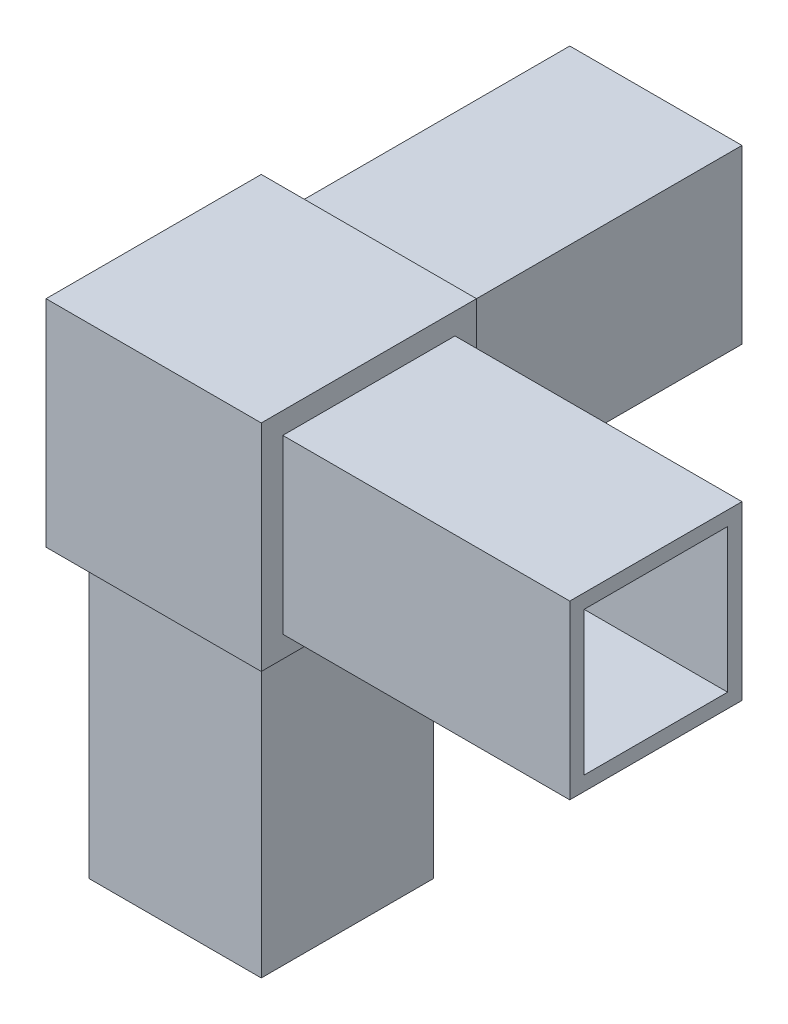
ISO-10303-21;
HEADER;
FILE_DESCRIPTION(('STEP AP214'),'2;1');
FILE_NAME('part.step','',(''),(''),'','','');
FILE_SCHEMA(('AUTOMOTIVE_DESIGN { 1 0 10303 214 1 1 1 1 }'));
ENDSEC;
DATA;
#1=APPLICATION_CONTEXT('core data for automotive mechanical design processes');
#2=APPLICATION_PROTOCOL_DEFINITION('international standard','automotive_design',2000,#1);
#3=PRODUCT_CONTEXT('',#1,'mechanical');
#4=PRODUCT('Part','Part','',(#3));
#5=PRODUCT_RELATED_PRODUCT_CATEGORY('part','',(#4));
#6=PRODUCT_DEFINITION_FORMATION('','',#4);
#7=PRODUCT_DEFINITION_CONTEXT('part definition',#1,'design');
#8=PRODUCT_DEFINITION('design','',#6,#7);
#9=PRODUCT_DEFINITION_SHAPE('','',#8);
#10=(LENGTH_UNIT() NAMED_UNIT(*) SI_UNIT(.MILLI.,.METRE.));
#11=(NAMED_UNIT(*) PLANE_ANGLE_UNIT() SI_UNIT($,.RADIAN.));
#12=(NAMED_UNIT(*) SI_UNIT($,.STERADIAN.) SOLID_ANGLE_UNIT());
#13=UNCERTAINTY_MEASURE_WITH_UNIT(LENGTH_MEASURE(1.E-05),#10,'distance_accuracy_value','');
#14=(GEOMETRIC_REPRESENTATION_CONTEXT(3) GLOBAL_UNCERTAINTY_ASSIGNED_CONTEXT((#13)) GLOBAL_UNIT_ASSIGNED_CONTEXT((#10,
#11,#12)) REPRESENTATION_CONTEXT('',''));
#15=CARTESIAN_POINT('',(0.,0.,0.));
#16=DIRECTION('',(0.,0.,1.));
#17=DIRECTION('',(1.,0.,0.));
#18=AXIS2_PLACEMENT_3D('',#15,#16,#17);
#19=CARTESIAN_POINT('',(55.,30.,-14.0461219660688));
#20=DIRECTION('',(-1.,0.,0.));
#21=DIRECTION('',(0.,0.,1.));
#22=AXIS2_PLACEMENT_3D('',#19,#20,#21);
#23=PLANE('',#22);
#24=DIRECTION('',(0.,-1.,0.));
#25=VECTOR('',#24,1.);
#26=CARTESIAN_POINT('',(55.,27.,12.));
#27=LINE('',#26,#25);
#28=CARTESIAN_POINT('',(55.,27.,12.));
#29=VERTEX_POINT('',#28);
#30=CARTESIAN_POINT('',(55.,3.,12.));
#31=VERTEX_POINT('',#30);
#32=EDGE_CURVE('E460',#29,#31,#27,.T.);
#33=ORIENTED_EDGE('',*,*,#32,.T.);
#34=DIRECTION('',(0.,0.,-1.));
#35=VECTOR('',#34,1.);
#36=CARTESIAN_POINT('',(55.,3.,12.));
#37=LINE('',#36,#35);
#38=CARTESIAN_POINT('',(55.,3.,-12.));
#39=VERTEX_POINT('',#38);
#40=EDGE_CURVE('E477',#31,#39,#37,.T.);
#41=ORIENTED_EDGE('',*,*,#40,.T.);
#42=DIRECTION('',(0.,1.,0.));
#43=VECTOR('',#42,1.);
#44=CARTESIAN_POINT('',(55.,3.,-12.));
#45=LINE('',#44,#43);
#46=CARTESIAN_POINT('',(55.,27.,-12.));
#47=VERTEX_POINT('',#46);
#48=EDGE_CURVE('E480',#39,#47,#45,.T.);
#49=ORIENTED_EDGE('',*,*,#48,.T.);
#50=DIRECTION('',(0.,0.,1.));
#51=VECTOR('',#50,1.);
#52=CARTESIAN_POINT('',(55.,27.,-12.));
#53=LINE('',#52,#51);
#54=EDGE_CURVE('E465',#47,#29,#53,.T.);
#55=ORIENTED_EDGE('',*,*,#54,.T.);
#56=EDGE_LOOP('',(#33,#41,#49,#55));
#57=FACE_BOUND('',#56,.T.);
#58=DIRECTION('',(0.,-1.,0.));
#59=VECTOR('',#58,1.);
#60=CARTESIAN_POINT('',(55.,27.,10.));
#61=LINE('',#60,#59);
#62=CARTESIAN_POINT('',(55.,25.,10.));
#63=VERTEX_POINT('',#62);
#64=CARTESIAN_POINT('',(55.,5.,10.));
#65=VERTEX_POINT('',#64);
#66=EDGE_CURVE('E269',#63,#65,#61,.T.);
#67=ORIENTED_EDGE('',*,*,#66,.F.);
#68=DIRECTION('',(0.,0.,1.));
#69=VECTOR('',#68,1.);
#70=CARTESIAN_POINT('',(55.,25.,-12.));
#71=LINE('',#70,#69);
#72=CARTESIAN_POINT('',(55.,25.,-10.));
#73=VERTEX_POINT('',#72);
#74=EDGE_CURVE('E302',#73,#63,#71,.T.);
#75=ORIENTED_EDGE('',*,*,#74,.F.);
#76=DIRECTION('',(0.,1.,0.));
#77=VECTOR('',#76,1.);
#78=CARTESIAN_POINT('',(55.,3.,-10.));
#79=LINE('',#78,#77);
#80=CARTESIAN_POINT('',(55.,5.,-10.));
#81=VERTEX_POINT('',#80);
#82=EDGE_CURVE('E55',#81,#73,#79,.T.);
#83=ORIENTED_EDGE('',*,*,#82,.F.);
#84=DIRECTION('',(0.,0.,-1.));
#85=VECTOR('',#84,1.);
#86=CARTESIAN_POINT('',(55.,5.,12.));
#87=LINE('',#86,#85);
#88=EDGE_CURVE('E377',#65,#81,#87,.T.);
#89=ORIENTED_EDGE('',*,*,#88,.F.);
#90=EDGE_LOOP('',(#67,#75,#83,#89));
#91=FACE_BOUND('',#90,.T.);
#92=ADVANCED_FACE('F37',(#57,#91),#23,.F.);
#93=CARTESIAN_POINT('',(-15.,30.,-14.0461219660688));
#94=DIRECTION('',(-1.,0.,0.));
#95=DIRECTION('',(0.,0.,1.));
#96=AXIS2_PLACEMENT_3D('',#93,#94,#95);
#97=PLANE('',#96);
#98=DIRECTION('',(0.,1.,0.));
#99=VECTOR('',#98,1.);
#100=CARTESIAN_POINT('',(-15.,-40.,-15.));
#101=LINE('',#100,#99);
#102=CARTESIAN_POINT('',(-15.,0.,-15.));
#103=VERTEX_POINT('',#102);
#104=CARTESIAN_POINT('',(-15.,30.,-15.));
#105=VERTEX_POINT('',#104);
#106=EDGE_CURVE('E495',#103,#105,#101,.T.);
#107=ORIENTED_EDGE('',*,*,#106,.F.);
#108=DIRECTION('',(0.,0.,-1.));
#109=VECTOR('',#108,1.);
#110=CARTESIAN_POINT('',(-15.,0.,15.));
#111=LINE('',#110,#109);
#112=CARTESIAN_POINT('',(-15.,0.,15.));
#113=VERTEX_POINT('',#112);
#114=EDGE_CURVE('E418',#113,#103,#111,.T.);
#115=ORIENTED_EDGE('',*,*,#114,.F.);
#116=DIRECTION('',(0.,-1.,0.));
#117=VECTOR('',#116,1.);
#118=CARTESIAN_POINT('',(-15.,30.,15.));
#119=LINE('',#118,#117);
#120=CARTESIAN_POINT('',(-15.,30.,15.));
#121=VERTEX_POINT('',#120);
#122=EDGE_CURVE('E11',#121,#113,#119,.T.);
#123=ORIENTED_EDGE('',*,*,#122,.F.);
#124=DIRECTION('',(0.,0.,-1.));
#125=VECTOR('',#124,1.);
#126=CARTESIAN_POINT('',(-15.,30.,-14.0461219660688));
#127=LINE('',#126,#125);
#128=EDGE_CURVE('E496',#121,#105,#127,.T.);
#129=ORIENTED_EDGE('',*,*,#128,.T.);
#130=EDGE_LOOP('',(#107,#115,#123,#129));
#131=FACE_BOUND('',#130,.T.);
#132=ADVANCED_FACE('F39',(#131),#97,.T.);
#133=CARTESIAN_POINT('',(15.,30.,-14.0461219660688));
#134=DIRECTION('',(-1.,0.,0.));
#135=DIRECTION('',(0.,0.,1.));
#136=AXIS2_PLACEMENT_3D('',#133,#134,#135);
#137=PLANE('',#136);
#138=DIRECTION('',(0.,0.,1.));
#139=VECTOR('',#138,1.);
#140=CARTESIAN_POINT('',(15.,27.,-12.));
#141=LINE('',#140,#139);
#142=CARTESIAN_POINT('',(15.,27.,-12.));
#143=VERTEX_POINT('',#142);
#144=CARTESIAN_POINT('',(15.,27.,12.));
#145=VERTEX_POINT('',#144);
#146=EDGE_CURVE('E471',#143,#145,#141,.T.);
#147=ORIENTED_EDGE('',*,*,#146,.F.);
#148=DIRECTION('',(0.,1.,0.));
#149=VECTOR('',#148,1.);
#150=CARTESIAN_POINT('',(15.,3.,-12.));
#151=LINE('',#150,#149);
#152=CARTESIAN_POINT('',(15.,3.,-12.));
#153=VERTEX_POINT('',#152);
#154=EDGE_CURVE('E468',#153,#143,#151,.T.);
#155=ORIENTED_EDGE('',*,*,#154,.F.);
#156=DIRECTION('',(0.,0.,-1.));
#157=VECTOR('',#156,1.);
#158=CARTESIAN_POINT('',(15.,3.,12.));
#159=LINE('',#158,#157);
#160=CARTESIAN_POINT('',(15.,3.,12.));
#161=VERTEX_POINT('',#160);
#162=EDGE_CURVE('E464',#161,#153,#159,.T.);
#163=ORIENTED_EDGE('',*,*,#162,.F.);
#164=DIRECTION('',(0.,-1.,0.));
#165=VECTOR('',#164,1.);
#166=CARTESIAN_POINT('',(15.,27.,12.));
#167=LINE('',#166,#165);
#168=EDGE_CURVE('E461',#145,#161,#167,.T.);
#169=ORIENTED_EDGE('',*,*,#168,.F.);
#170=EDGE_LOOP('',(#147,#155,#163,#169));
#171=FACE_BOUND('',#170,.T.);
#172=DIRECTION('',(0.,0.,1.));
#173=VECTOR('',#172,1.);
#174=CARTESIAN_POINT('',(15.,0.,-15.));
#175=LINE('',#174,#173);
#176=CARTESIAN_POINT('',(15.,0.,-15.));
#177=VERTEX_POINT('',#176);
#178=CARTESIAN_POINT('',(15.,0.,15.));
#179=VERTEX_POINT('',#178);
#180=EDGE_CURVE('E422',#177,#179,#175,.T.);
#181=ORIENTED_EDGE('',*,*,#180,.F.);
#182=DIRECTION('',(0.,1.,0.));
#183=VECTOR('',#182,1.);
#184=CARTESIAN_POINT('',(15.,-40.,-15.));
#185=LINE('',#184,#183);
#186=CARTESIAN_POINT('',(15.,30.,-15.));
#187=VERTEX_POINT('',#186);
#188=EDGE_CURVE('E493',#177,#187,#185,.T.);
#189=ORIENTED_EDGE('',*,*,#188,.T.);
#190=DIRECTION('',(0.,0.,-1.));
#191=VECTOR('',#190,1.);
#192=CARTESIAN_POINT('',(15.,30.,-14.0461219660688));
#193=LINE('',#192,#191);
#194=CARTESIAN_POINT('',(15.,30.,15.));
#195=VERTEX_POINT('',#194);
#196=EDGE_CURVE('E47',#195,#187,#193,.T.);
#197=ORIENTED_EDGE('',*,*,#196,.F.);
#198=DIRECTION('',(0.,1.,0.));
#199=VECTOR('',#198,1.);
#200=CARTESIAN_POINT('',(15.,-40.,15.));
#201=LINE('',#200,#199);
#202=EDGE_CURVE('E41',#179,#195,#201,.T.);
#203=ORIENTED_EDGE('',*,*,#202,.F.);
#204=EDGE_LOOP('',(#181,#189,#197,#203));
#205=FACE_BOUND('',#204,.T.);
#206=ADVANCED_FACE('F525',(#171,#205),#137,.F.);
#207=CARTESIAN_POINT('',(-80.1827679437956,30.,15.));
#208=DIRECTION('',(0.,0.,1.));
#209=DIRECTION('',(1.,0.,0.));
#210=AXIS2_PLACEMENT_3D('',#207,#208,#209);
#211=PLANE('',#210);
#212=ORIENTED_EDGE('',*,*,#122,.T.);
#213=DIRECTION('',(-1.,0.,0.));
#214=VECTOR('',#213,1.);
#215=CARTESIAN_POINT('',(15.,0.,15.));
#216=LINE('',#215,#214);
#217=EDGE_CURVE('E410',#179,#113,#216,.T.);
#218=ORIENTED_EDGE('',*,*,#217,.F.);
#219=ORIENTED_EDGE('',*,*,#202,.T.);
#220=DIRECTION('',(-1.,0.,0.));
#221=VECTOR('',#220,1.);
#222=CARTESIAN_POINT('',(-80.1827679437956,30.,15.));
#223=LINE('',#222,#221);
#224=EDGE_CURVE('E499',#195,#121,#223,.T.);
#225=ORIENTED_EDGE('',*,*,#224,.T.);
#226=EDGE_LOOP('',(#212,#218,#219,#225));
#227=FACE_BOUND('',#226,.T.);
#228=ADVANCED_FACE('F521',(#227),#211,.T.);
#229=CARTESIAN_POINT('',(-15.,-40.,-15.));
#230=DIRECTION('',(0.,0.,1.));
#231=DIRECTION('',(1.,0.,0.));
#232=AXIS2_PLACEMENT_3D('',#229,#230,#231);
#233=PLANE('',#232);
#234=DIRECTION('',(1.,0.,0.));
#235=VECTOR('',#234,1.);
#236=CARTESIAN_POINT('',(-12.,27.,-15.));
#237=LINE('',#236,#235);
#238=CARTESIAN_POINT('',(-12.,27.,-15.));
#239=VERTEX_POINT('',#238);
#240=CARTESIAN_POINT('',(12.,27.,-15.));
#241=VERTEX_POINT('',#240);
#242=EDGE_CURVE('E435',#239,#241,#237,.T.);
#243=ORIENTED_EDGE('',*,*,#242,.F.);
#244=DIRECTION('',(0.,1.,0.));
#245=VECTOR('',#244,1.);
#246=CARTESIAN_POINT('',(-12.,3.,-15.));
#247=LINE('',#246,#245);
#248=CARTESIAN_POINT('',(-12.,3.,-15.));
#249=VERTEX_POINT('',#248);
#250=EDGE_CURVE('E432',#249,#239,#247,.T.);
#251=ORIENTED_EDGE('',*,*,#250,.F.);
#252=DIRECTION('',(-1.,0.,0.));
#253=VECTOR('',#252,1.);
#254=CARTESIAN_POINT('',(12.,3.,-15.));
#255=LINE('',#254,#253);
#256=CARTESIAN_POINT('',(12.,3.,-15.));
#257=VERTEX_POINT('',#256);
#258=EDGE_CURVE('E428',#257,#249,#255,.T.);
#259=ORIENTED_EDGE('',*,*,#258,.F.);
#260=DIRECTION('',(0.,-1.,0.));
#261=VECTOR('',#260,1.);
#262=CARTESIAN_POINT('',(12.,27.,-15.));
#263=LINE('',#262,#261);
#264=EDGE_CURVE('E425',#241,#257,#263,.T.);
#265=ORIENTED_EDGE('',*,*,#264,.F.);
#266=EDGE_LOOP('',(#243,#251,#259,#265));
#267=FACE_BOUND('',#266,.T.);
#268=DIRECTION('',(1.,0.,0.));
#269=VECTOR('',#268,1.);
#270=CARTESIAN_POINT('',(-15.,0.,-15.));
#271=LINE('',#270,#269);
#272=EDGE_CURVE('E420',#103,#177,#271,.T.);
#273=ORIENTED_EDGE('',*,*,#272,.F.);
#274=ORIENTED_EDGE('',*,*,#106,.T.);
#275=DIRECTION('',(1.,0.,0.));
#276=VECTOR('',#275,1.);
#277=CARTESIAN_POINT('',(-15.,30.,-15.));
#278=LINE('',#277,#276);
#279=EDGE_CURVE('E451',#105,#187,#278,.T.);
#280=ORIENTED_EDGE('',*,*,#279,.T.);
#281=ORIENTED_EDGE('',*,*,#188,.F.);
#282=EDGE_LOOP('',(#273,#274,#280,#281));
#283=FACE_BOUND('',#282,.T.);
#284=ADVANCED_FACE('F509',(#267,#283),#233,.F.);
#285=CARTESIAN_POINT('',(-80.1827679437956,30.,-14.0461219660688));
#286=DIRECTION('',(0.,1.,0.));
#287=DIRECTION('',(0.,0.,1.));
#288=AXIS2_PLACEMENT_3D('',#285,#286,#287);
#289=PLANE('',#288);
#290=ORIENTED_EDGE('',*,*,#196,.T.);
#291=ORIENTED_EDGE('',*,*,#279,.F.);
#292=ORIENTED_EDGE('',*,*,#128,.F.);
#293=ORIENTED_EDGE('',*,*,#224,.F.);
#294=EDGE_LOOP('',(#290,#291,#292,#293));
#295=FACE_BOUND('',#294,.T.);
#296=ADVANCED_FACE('F515',(#295),#289,.T.);
#297=CARTESIAN_POINT('',(15.,27.,12.));
#298=DIRECTION('',(0.,0.,1.));
#299=DIRECTION('',(1.,0.,0.));
#300=AXIS2_PLACEMENT_3D('',#297,#298,#299);
#301=PLANE('',#300);
#302=ORIENTED_EDGE('',*,*,#32,.F.);
#303=DIRECTION('',(1.,0.,0.));
#304=VECTOR('',#303,1.);
#305=CARTESIAN_POINT('',(15.,27.,12.));
#306=LINE('',#305,#304);
#307=EDGE_CURVE('E485',#145,#29,#306,.T.);
#308=ORIENTED_EDGE('',*,*,#307,.F.);
#309=ORIENTED_EDGE('',*,*,#168,.T.);
#310=DIRECTION('',(1.,0.,0.));
#311=VECTOR('',#310,1.);
#312=CARTESIAN_POINT('',(15.,3.,12.));
#313=LINE('',#312,#311);
#314=EDGE_CURVE('E474',#161,#31,#313,.T.);
#315=ORIENTED_EDGE('',*,*,#314,.T.);
#316=EDGE_LOOP('',(#302,#308,#309,#315));
#317=FACE_BOUND('',#316,.T.);
#318=ADVANCED_FACE('F576',(#317),#301,.T.);
#319=CARTESIAN_POINT('',(15.,27.,-12.));
#320=DIRECTION('',(0.,1.,0.));
#321=DIRECTION('',(0.,0.,1.));
#322=AXIS2_PLACEMENT_3D('',#319,#320,#321);
#323=PLANE('',#322);
#324=ORIENTED_EDGE('',*,*,#54,.F.);
#325=DIRECTION('',(1.,0.,0.));
#326=VECTOR('',#325,1.);
#327=CARTESIAN_POINT('',(15.,27.,-12.));
#328=LINE('',#327,#326);
#329=EDGE_CURVE('E487',#143,#47,#328,.T.);
#330=ORIENTED_EDGE('',*,*,#329,.F.);
#331=ORIENTED_EDGE('',*,*,#146,.T.);
#332=ORIENTED_EDGE('',*,*,#307,.T.);
#333=EDGE_LOOP('',(#324,#330,#331,#332));
#334=FACE_BOUND('',#333,.T.);
#335=ADVANCED_FACE('F577',(#334),#323,.T.);
#336=CARTESIAN_POINT('',(15.,3.,-12.));
#337=DIRECTION('',(0.,0.,-1.));
#338=DIRECTION('',(-1.,0.,0.));
#339=AXIS2_PLACEMENT_3D('',#336,#337,#338);
#340=PLANE('',#339);
#341=ORIENTED_EDGE('',*,*,#48,.F.);
#342=DIRECTION('',(1.,0.,0.));
#343=VECTOR('',#342,1.);
#344=CARTESIAN_POINT('',(15.,3.,-12.));
#345=LINE('',#344,#343);
#346=EDGE_CURVE('E489',#153,#39,#345,.T.);
#347=ORIENTED_EDGE('',*,*,#346,.F.);
#348=ORIENTED_EDGE('',*,*,#154,.T.);
#349=ORIENTED_EDGE('',*,*,#329,.T.);
#350=EDGE_LOOP('',(#341,#347,#348,#349));
#351=FACE_BOUND('',#350,.T.);
#352=ADVANCED_FACE('F569',(#351),#340,.T.);
#353=CARTESIAN_POINT('',(15.,3.,12.));
#354=DIRECTION('',(0.,-1.,0.));
#355=DIRECTION('',(0.,0.,-1.));
#356=AXIS2_PLACEMENT_3D('',#353,#354,#355);
#357=PLANE('',#356);
#358=ORIENTED_EDGE('',*,*,#40,.F.);
#359=ORIENTED_EDGE('',*,*,#314,.F.);
#360=ORIENTED_EDGE('',*,*,#162,.T.);
#361=ORIENTED_EDGE('',*,*,#346,.T.);
#362=EDGE_LOOP('',(#358,#359,#360,#361));
#363=FACE_BOUND('',#362,.T.);
#364=ADVANCED_FACE('F573',(#363),#357,.T.);
#365=CARTESIAN_POINT('',(12.,27.,-15.));
#366=DIRECTION('',(1.,0.,0.));
#367=DIRECTION('',(0.,1.,0.));
#368=AXIS2_PLACEMENT_3D('',#365,#366,#367);
#369=PLANE('',#368);
#370=DIRECTION('',(0.,-1.,0.));
#371=VECTOR('',#370,1.);
#372=CARTESIAN_POINT('',(12.,27.,-55.));
#373=LINE('',#372,#371);
#374=CARTESIAN_POINT('',(12.,27.,-55.));
#375=VERTEX_POINT('',#374);
#376=CARTESIAN_POINT('',(12.,3.,-55.));
#377=VERTEX_POINT('',#376);
#378=EDGE_CURVE('E424',#375,#377,#373,.T.);
#379=ORIENTED_EDGE('',*,*,#378,.F.);
#380=DIRECTION('',(0.,0.,-1.));
#381=VECTOR('',#380,1.);
#382=CARTESIAN_POINT('',(12.,27.,-15.));
#383=LINE('',#382,#381);
#384=EDGE_CURVE('E449',#241,#375,#383,.T.);
#385=ORIENTED_EDGE('',*,*,#384,.F.);
#386=ORIENTED_EDGE('',*,*,#264,.T.);
#387=DIRECTION('',(0.,0.,-1.));
#388=VECTOR('',#387,1.);
#389=CARTESIAN_POINT('',(12.,3.,-15.));
#390=LINE('',#389,#388);
#391=EDGE_CURVE('E438',#257,#377,#390,.T.);
#392=ORIENTED_EDGE('',*,*,#391,.T.);
#393=EDGE_LOOP('',(#379,#385,#386,#392));
#394=FACE_BOUND('',#393,.T.);
#395=ADVANCED_FACE('F587',(#394),#369,.T.);
#396=CARTESIAN_POINT('',(-12.,27.,-15.));
#397=DIRECTION('',(0.,1.,0.));
#398=DIRECTION('',(-1.,0.,0.));
#399=AXIS2_PLACEMENT_3D('',#396,#397,#398);
#400=PLANE('',#399);
#401=DIRECTION('',(1.,0.,0.));
#402=VECTOR('',#401,1.);
#403=CARTESIAN_POINT('',(-12.,27.,-55.));
#404=LINE('',#403,#402);
#405=CARTESIAN_POINT('',(-12.,27.,-55.));
#406=VERTEX_POINT('',#405);
#407=EDGE_CURVE('E429',#406,#375,#404,.T.);
#408=ORIENTED_EDGE('',*,*,#407,.F.);
#409=DIRECTION('',(0.,0.,-1.));
#410=VECTOR('',#409,1.);
#411=CARTESIAN_POINT('',(-12.,27.,-15.));
#412=LINE('',#411,#410);
#413=EDGE_CURVE('E452',#239,#406,#412,.T.);
#414=ORIENTED_EDGE('',*,*,#413,.F.);
#415=ORIENTED_EDGE('',*,*,#242,.T.);
#416=ORIENTED_EDGE('',*,*,#384,.T.);
#417=EDGE_LOOP('',(#408,#414,#415,#416));
#418=FACE_BOUND('',#417,.T.);
#419=ADVANCED_FACE('F631',(#418),#400,.T.);
#420=CARTESIAN_POINT('',(-12.,3.,-15.));
#421=DIRECTION('',(-1.,0.,0.));
#422=DIRECTION('',(0.,0.,1.));
#423=AXIS2_PLACEMENT_3D('',#420,#421,#422);
#424=PLANE('',#423);
#425=DIRECTION('',(0.,1.,0.));
#426=VECTOR('',#425,1.);
#427=CARTESIAN_POINT('',(-12.,3.,-55.));
#428=LINE('',#427,#426);
#429=CARTESIAN_POINT('',(-12.,3.,-55.));
#430=VERTEX_POINT('',#429);
#431=EDGE_CURVE('E444',#430,#406,#428,.T.);
#432=ORIENTED_EDGE('',*,*,#431,.F.);
#433=DIRECTION('',(0.,0.,-1.));
#434=VECTOR('',#433,1.);
#435=CARTESIAN_POINT('',(-12.,3.,-15.));
#436=LINE('',#435,#434);
#437=EDGE_CURVE('E454',#249,#430,#436,.T.);
#438=ORIENTED_EDGE('',*,*,#437,.F.);
#439=ORIENTED_EDGE('',*,*,#250,.T.);
#440=ORIENTED_EDGE('',*,*,#413,.T.);
#441=EDGE_LOOP('',(#432,#438,#439,#440));
#442=FACE_BOUND('',#441,.T.);
#443=ADVANCED_FACE('F638',(#442),#424,.T.);
#444=CARTESIAN_POINT('',(12.,3.,-15.));
#445=DIRECTION('',(0.,-1.,0.));
#446=DIRECTION('',(1.,0.,0.));
#447=AXIS2_PLACEMENT_3D('',#444,#445,#446);
#448=PLANE('',#447);
#449=DIRECTION('',(-1.,0.,0.));
#450=VECTOR('',#449,1.);
#451=CARTESIAN_POINT('',(12.,3.,-55.));
#452=LINE('',#451,#450);
#453=EDGE_CURVE('E441',#377,#430,#452,.T.);
#454=ORIENTED_EDGE('',*,*,#453,.F.);
#455=ORIENTED_EDGE('',*,*,#391,.F.);
#456=ORIENTED_EDGE('',*,*,#258,.T.);
#457=ORIENTED_EDGE('',*,*,#437,.T.);
#458=EDGE_LOOP('',(#454,#455,#456,#457));
#459=FACE_BOUND('',#458,.T.);
#460=ADVANCED_FACE('F540',(#459),#448,.T.);
#461=CARTESIAN_POINT('',(-80.1827679437956,30.,-55.));
#462=DIRECTION('',(0.,0.,-1.));
#463=DIRECTION('',(-1.,0.,0.));
#464=AXIS2_PLACEMENT_3D('',#461,#462,#463);
#465=PLANE('',#464);
#466=DIRECTION('',(1.,0.,0.));
#467=VECTOR('',#466,1.);
#468=CARTESIAN_POINT('',(-80.1827679437956,25.,-55.));
#469=LINE('',#468,#467);
#470=CARTESIAN_POINT('',(-10.,25.,-55.));
#471=VERTEX_POINT('',#470);
#472=CARTESIAN_POINT('',(10.,25.,-55.));
#473=VERTEX_POINT('',#472);
#474=EDGE_CURVE('E322',#471,#473,#469,.T.);
#475=ORIENTED_EDGE('',*,*,#474,.F.);
#476=DIRECTION('',(0.,1.,0.));
#477=VECTOR('',#476,1.);
#478=CARTESIAN_POINT('',(-9.99999999999999,30.,-55.));
#479=LINE('',#478,#477);
#480=CARTESIAN_POINT('',(-10.,5.,-55.));
#481=VERTEX_POINT('',#480);
#482=EDGE_CURVE('E360',#481,#471,#479,.T.);
#483=ORIENTED_EDGE('',*,*,#482,.F.);
#484=DIRECTION('',(-1.,0.,0.));
#485=VECTOR('',#484,1.);
#486=CARTESIAN_POINT('',(-80.1827679437956,5.,-55.));
#487=LINE('',#486,#485);
#488=CARTESIAN_POINT('',(10.,5.,-55.));
#489=VERTEX_POINT('',#488);
#490=EDGE_CURVE('E63',#489,#481,#487,.T.);
#491=ORIENTED_EDGE('',*,*,#490,.F.);
#492=DIRECTION('',(0.,-1.,0.));
#493=VECTOR('',#492,1.);
#494=CARTESIAN_POINT('',(10.,30.,-55.));
#495=LINE('',#494,#493);
#496=EDGE_CURVE('E305',#473,#489,#495,.T.);
#497=ORIENTED_EDGE('',*,*,#496,.F.);
#498=EDGE_LOOP('',(#475,#483,#491,#497));
#499=FACE_BOUND('',#498,.T.);
#500=ORIENTED_EDGE('',*,*,#407,.T.);
#501=ORIENTED_EDGE('',*,*,#378,.T.);
#502=ORIENTED_EDGE('',*,*,#453,.T.);
#503=ORIENTED_EDGE('',*,*,#431,.T.);
#504=EDGE_LOOP('',(#500,#501,#502,#503));
#505=FACE_BOUND('',#504,.T.);
#506=ADVANCED_FACE('F530',(#499,#505),#465,.T.);
#507=CARTESIAN_POINT('',(-15.,0.,15.));
#508=DIRECTION('',(0.,-1.,0.));
#509=DIRECTION('',(0.,0.,-1.));
#510=AXIS2_PLACEMENT_3D('',#507,#508,#509);
#511=PLANE('',#510);
#512=DIRECTION('',(0.,0.,1.));
#513=VECTOR('',#512,1.);
#514=CARTESIAN_POINT('',(12.,0.,-12.));
#515=LINE('',#514,#513);
#516=CARTESIAN_POINT('',(12.,0.,-12.));
#517=VERTEX_POINT('',#516);
#518=CARTESIAN_POINT('',(12.,0.,12.));
#519=VERTEX_POINT('',#518);
#520=EDGE_CURVE('E393',#517,#519,#515,.T.);
#521=ORIENTED_EDGE('',*,*,#520,.F.);
#522=DIRECTION('',(1.,0.,0.));
#523=VECTOR('',#522,1.);
#524=CARTESIAN_POINT('',(-12.,0.,-12.));
#525=LINE('',#524,#523);
#526=CARTESIAN_POINT('',(-12.,0.,-12.));
#527=VERTEX_POINT('',#526);
#528=EDGE_CURVE('E390',#527,#517,#525,.T.);
#529=ORIENTED_EDGE('',*,*,#528,.F.);
#530=DIRECTION('',(0.,0.,-1.));
#531=VECTOR('',#530,1.);
#532=CARTESIAN_POINT('',(-12.,0.,12.));
#533=LINE('',#532,#531);
#534=CARTESIAN_POINT('',(-12.,0.,12.));
#535=VERTEX_POINT('',#534);
#536=EDGE_CURVE('E386',#535,#527,#533,.T.);
#537=ORIENTED_EDGE('',*,*,#536,.F.);
#538=DIRECTION('',(-1.,0.,0.));
#539=VECTOR('',#538,1.);
#540=CARTESIAN_POINT('',(12.,0.,12.));
#541=LINE('',#540,#539);
#542=EDGE_CURVE('E383',#519,#535,#541,.T.);
#543=ORIENTED_EDGE('',*,*,#542,.F.);
#544=EDGE_LOOP('',(#521,#529,#537,#543));
#545=FACE_BOUND('',#544,.T.);
#546=ORIENTED_EDGE('',*,*,#217,.T.);
#547=ORIENTED_EDGE('',*,*,#114,.T.);
#548=ORIENTED_EDGE('',*,*,#272,.T.);
#549=ORIENTED_EDGE('',*,*,#180,.T.);
#550=EDGE_LOOP('',(#546,#547,#548,#549));
#551=FACE_BOUND('',#550,.T.);
#552=ADVANCED_FACE('F527',(#545,#551),#511,.T.);
#553=CARTESIAN_POINT('',(12.,0.,12.));
#554=DIRECTION('',(0.,0.,1.));
#555=DIRECTION('',(1.,0.,0.));
#556=AXIS2_PLACEMENT_3D('',#553,#554,#555);
#557=PLANE('',#556);
#558=DIRECTION('',(-1.,0.,0.));
#559=VECTOR('',#558,1.);
#560=CARTESIAN_POINT('',(12.,-40.,12.));
#561=LINE('',#560,#559);
#562=CARTESIAN_POINT('',(12.,-40.,12.));
#563=VERTEX_POINT('',#562);
#564=CARTESIAN_POINT('',(-12.,-40.,12.));
#565=VERTEX_POINT('',#564);
#566=EDGE_CURVE('E397',#563,#565,#561,.T.);
#567=ORIENTED_EDGE('',*,*,#566,.F.);
#568=DIRECTION('',(0.,-1.,0.));
#569=VECTOR('',#568,1.);
#570=CARTESIAN_POINT('',(12.,0.,12.));
#571=LINE('',#570,#569);
#572=EDGE_CURVE('E408',#519,#563,#571,.T.);
#573=ORIENTED_EDGE('',*,*,#572,.F.);
#574=ORIENTED_EDGE('',*,*,#542,.T.);
#575=DIRECTION('',(0.,-1.,0.));
#576=VECTOR('',#575,1.);
#577=CARTESIAN_POINT('',(-12.,0.,12.));
#578=LINE('',#577,#576);
#579=EDGE_CURVE('E396',#535,#565,#578,.T.);
#580=ORIENTED_EDGE('',*,*,#579,.T.);
#581=EDGE_LOOP('',(#567,#573,#574,#580));
#582=FACE_BOUND('',#581,.T.);
#583=ADVANCED_FACE('F529',(#582),#557,.T.);
#584=CARTESIAN_POINT('',(12.,0.,-12.));
#585=DIRECTION('',(1.,0.,0.));
#586=DIRECTION('',(0.,0.,-1.));
#587=AXIS2_PLACEMENT_3D('',#584,#585,#586);
#588=PLANE('',#587);
#589=DIRECTION('',(0.,0.,1.));
#590=VECTOR('',#589,1.);
#591=CARTESIAN_POINT('',(12.,-40.,-12.));
#592=LINE('',#591,#590);
#593=CARTESIAN_POINT('',(12.,-40.,-12.));
#594=VERTEX_POINT('',#593);
#595=EDGE_CURVE('E387',#594,#563,#592,.T.);
#596=ORIENTED_EDGE('',*,*,#595,.F.);
#597=DIRECTION('',(0.,-1.,0.));
#598=VECTOR('',#597,1.);
#599=CARTESIAN_POINT('',(12.,0.,-12.));
#600=LINE('',#599,#598);
#601=EDGE_CURVE('E411',#517,#594,#600,.T.);
#602=ORIENTED_EDGE('',*,*,#601,.F.);
#603=ORIENTED_EDGE('',*,*,#520,.T.);
#604=ORIENTED_EDGE('',*,*,#572,.T.);
#605=EDGE_LOOP('',(#596,#602,#603,#604));
#606=FACE_BOUND('',#605,.T.);
#607=ADVANCED_FACE('F537',(#606),#588,.T.);
#608=CARTESIAN_POINT('',(-12.,0.,-12.));
#609=DIRECTION('',(0.,0.,-1.));
#610=DIRECTION('',(-1.,0.,0.));
#611=AXIS2_PLACEMENT_3D('',#608,#609,#610);
#612=PLANE('',#611);
#613=DIRECTION('',(1.,0.,0.));
#614=VECTOR('',#613,1.);
#615=CARTESIAN_POINT('',(-12.,-40.,-12.));
#616=LINE('',#615,#614);
#617=CARTESIAN_POINT('',(-12.,-40.,-12.));
#618=VERTEX_POINT('',#617);
#619=EDGE_CURVE('E403',#618,#594,#616,.T.);
#620=ORIENTED_EDGE('',*,*,#619,.F.);
#621=DIRECTION('',(0.,-1.,0.));
#622=VECTOR('',#621,1.);
#623=CARTESIAN_POINT('',(-12.,0.,-12.));
#624=LINE('',#623,#622);
#625=EDGE_CURVE('E413',#527,#618,#624,.T.);
#626=ORIENTED_EDGE('',*,*,#625,.F.);
#627=ORIENTED_EDGE('',*,*,#528,.T.);
#628=ORIENTED_EDGE('',*,*,#601,.T.);
#629=EDGE_LOOP('',(#620,#626,#627,#628));
#630=FACE_BOUND('',#629,.T.);
#631=ADVANCED_FACE('F856',(#630),#612,.T.);
#632=CARTESIAN_POINT('',(-12.,0.,12.));
#633=DIRECTION('',(-1.,0.,0.));
#634=DIRECTION('',(0.,0.,1.));
#635=AXIS2_PLACEMENT_3D('',#632,#633,#634);
#636=PLANE('',#635);
#637=DIRECTION('',(0.,0.,-1.));
#638=VECTOR('',#637,1.);
#639=CARTESIAN_POINT('',(-12.,-40.,12.));
#640=LINE('',#639,#638);
#641=EDGE_CURVE('E400',#565,#618,#640,.T.);
#642=ORIENTED_EDGE('',*,*,#641,.F.);
#643=ORIENTED_EDGE('',*,*,#579,.F.);
#644=ORIENTED_EDGE('',*,*,#536,.T.);
#645=ORIENTED_EDGE('',*,*,#625,.T.);
#646=EDGE_LOOP('',(#642,#643,#644,#645));
#647=FACE_BOUND('',#646,.T.);
#648=ADVANCED_FACE('F594',(#647),#636,.T.);
#649=CARTESIAN_POINT('',(-15.,-40.,-15.));
#650=DIRECTION('',(0.,-1.,0.));
#651=DIRECTION('',(0.,0.,-1.));
#652=AXIS2_PLACEMENT_3D('',#649,#650,#651);
#653=PLANE('',#652);
#654=DIRECTION('',(0.,0.,1.));
#655=VECTOR('',#654,1.);
#656=CARTESIAN_POINT('',(10.,-40.,-15.));
#657=LINE('',#656,#655);
#658=CARTESIAN_POINT('',(10.,-40.,-9.99999999999999));
#659=VERTEX_POINT('',#658);
#660=CARTESIAN_POINT('',(10.,-40.,10.));
#661=VERTEX_POINT('',#660);
#662=EDGE_CURVE('E343',#659,#661,#657,.T.);
#663=ORIENTED_EDGE('',*,*,#662,.F.);
#664=DIRECTION('',(1.,0.,0.));
#665=VECTOR('',#664,1.);
#666=CARTESIAN_POINT('',(-15.,-40.,-9.99999999999999));
#667=LINE('',#666,#665);
#668=CARTESIAN_POINT('',(-10.,-40.,-9.99999999999999));
#669=VERTEX_POINT('',#668);
#670=EDGE_CURVE('E370',#669,#659,#667,.T.);
#671=ORIENTED_EDGE('',*,*,#670,.F.);
#672=DIRECTION('',(0.,0.,-1.));
#673=VECTOR('',#672,1.);
#674=CARTESIAN_POINT('',(-10.,-40.,-15.));
#675=LINE('',#674,#673);
#676=CARTESIAN_POINT('',(-10.,-40.,10.));
#677=VERTEX_POINT('',#676);
#678=EDGE_CURVE('E368',#677,#669,#675,.T.);
#679=ORIENTED_EDGE('',*,*,#678,.F.);
#680=DIRECTION('',(-1.,0.,0.));
#681=VECTOR('',#680,1.);
#682=CARTESIAN_POINT('',(-15.,-40.,10.));
#683=LINE('',#682,#681);
#684=EDGE_CURVE('E365',#661,#677,#683,.T.);
#685=ORIENTED_EDGE('',*,*,#684,.F.);
#686=EDGE_LOOP('',(#663,#671,#679,#685));
#687=FACE_BOUND('',#686,.T.);
#688=ORIENTED_EDGE('',*,*,#595,.T.);
#689=ORIENTED_EDGE('',*,*,#566,.T.);
#690=ORIENTED_EDGE('',*,*,#641,.T.);
#691=ORIENTED_EDGE('',*,*,#619,.T.);
#692=EDGE_LOOP('',(#688,#689,#690,#691));
#693=FACE_BOUND('',#692,.T.);
#694=ADVANCED_FACE('F592',(#687,#693),#653,.T.);
#695=CARTESIAN_POINT('',(-13.,30.,-14.0461219660688));
#696=DIRECTION('',(-1.,0.,0.));
#697=DIRECTION('',(0.,0.,1.));
#698=AXIS2_PLACEMENT_3D('',#695,#696,#697);
#699=PLANE('',#698);
#700=DIRECTION('',(0.,1.,0.));
#701=VECTOR('',#700,1.);
#702=CARTESIAN_POINT('',(-13.,30.,-13.));
#703=LINE('',#702,#701);
#704=CARTESIAN_POINT('',(-13.,2.,-13.));
#705=VERTEX_POINT('',#704);
#706=CARTESIAN_POINT('',(-13.,28.,-13.));
#707=VERTEX_POINT('',#706);
#708=EDGE_CURVE('E250',#705,#707,#703,.T.);
#709=ORIENTED_EDGE('',*,*,#708,.T.);
#710=DIRECTION('',(0.,0.,-1.));
#711=VECTOR('',#710,1.);
#712=CARTESIAN_POINT('',(-13.,28.,-14.0461219660688));
#713=LINE('',#712,#711);
#714=CARTESIAN_POINT('',(-13.,28.,13.));
#715=VERTEX_POINT('',#714);
#716=EDGE_CURVE('E255',#715,#707,#713,.T.);
#717=ORIENTED_EDGE('',*,*,#716,.F.);
#718=DIRECTION('',(0.,-1.,0.));
#719=VECTOR('',#718,1.);
#720=CARTESIAN_POINT('',(-13.,30.,13.));
#721=LINE('',#720,#719);
#722=CARTESIAN_POINT('',(-13.,2.,13.));
#723=VERTEX_POINT('',#722);
#724=EDGE_CURVE('E281',#715,#723,#721,.T.);
#725=ORIENTED_EDGE('',*,*,#724,.T.);
#726=DIRECTION('',(0.,0.,-1.));
#727=VECTOR('',#726,1.);
#728=CARTESIAN_POINT('',(-13.,2.,15.));
#729=LINE('',#728,#727);
#730=EDGE_CURVE('E257',#723,#705,#729,.T.);
#731=ORIENTED_EDGE('',*,*,#730,.T.);
#732=EDGE_LOOP('',(#709,#717,#725,#731));
#733=FACE_BOUND('',#732,.T.);
#734=ADVANCED_FACE('F252',(#733),#699,.F.);
#735=CARTESIAN_POINT('',(13.,30.,-14.0461219660688));
#736=DIRECTION('',(-1.,0.,0.));
#737=DIRECTION('',(0.,0.,1.));
#738=AXIS2_PLACEMENT_3D('',#735,#736,#737);
#739=PLANE('',#738);
#740=DIRECTION('',(0.,0.,1.));
#741=VECTOR('',#740,1.);
#742=CARTESIAN_POINT('',(13.,25.,-12.));
#743=LINE('',#742,#741);
#744=CARTESIAN_POINT('',(13.,25.,-10.));
#745=VERTEX_POINT('',#744);
#746=CARTESIAN_POINT('',(13.,25.,10.));
#747=VERTEX_POINT('',#746);
#748=EDGE_CURVE('E289',#745,#747,#743,.T.);
#749=ORIENTED_EDGE('',*,*,#748,.T.);
#750=DIRECTION('',(0.,-1.,0.));
#751=VECTOR('',#750,1.);
#752=CARTESIAN_POINT('',(13.,27.,10.));
#753=LINE('',#752,#751);
#754=CARTESIAN_POINT('',(13.,5.,10.));
#755=VERTEX_POINT('',#754);
#756=EDGE_CURVE('E299',#747,#755,#753,.T.);
#757=ORIENTED_EDGE('',*,*,#756,.T.);
#758=DIRECTION('',(0.,0.,-1.));
#759=VECTOR('',#758,1.);
#760=CARTESIAN_POINT('',(13.,5.,12.));
#761=LINE('',#760,#759);
#762=CARTESIAN_POINT('',(13.,5.,-10.));
#763=VERTEX_POINT('',#762);
#764=EDGE_CURVE('E296',#755,#763,#761,.T.);
#765=ORIENTED_EDGE('',*,*,#764,.T.);
#766=DIRECTION('',(0.,1.,0.));
#767=VECTOR('',#766,1.);
#768=CARTESIAN_POINT('',(13.,3.,-10.));
#769=LINE('',#768,#767);
#770=EDGE_CURVE('E293',#763,#745,#769,.T.);
#771=ORIENTED_EDGE('',*,*,#770,.T.);
#772=EDGE_LOOP('',(#749,#757,#765,#771));
#773=FACE_BOUND('',#772,.T.);
#774=DIRECTION('',(0.,0.,1.));
#775=VECTOR('',#774,1.);
#776=CARTESIAN_POINT('',(13.,2.,-14.0461219660688));
#777=LINE('',#776,#775);
#778=CARTESIAN_POINT('',(13.,2.,-13.));
#779=VERTEX_POINT('',#778);
#780=CARTESIAN_POINT('',(13.,2.,13.));
#781=VERTEX_POINT('',#780);
#782=EDGE_CURVE('E303',#779,#781,#777,.T.);
#783=ORIENTED_EDGE('',*,*,#782,.T.);
#784=DIRECTION('',(0.,1.,0.));
#785=VECTOR('',#784,1.);
#786=CARTESIAN_POINT('',(13.,30.,13.));
#787=LINE('',#786,#785);
#788=CARTESIAN_POINT('',(13.,28.,13.));
#789=VERTEX_POINT('',#788);
#790=EDGE_CURVE('E286',#781,#789,#787,.T.);
#791=ORIENTED_EDGE('',*,*,#790,.T.);
#792=DIRECTION('',(0.,0.,-1.));
#793=VECTOR('',#792,1.);
#794=CARTESIAN_POINT('',(13.,28.,-14.0461219660688));
#795=LINE('',#794,#793);
#796=CARTESIAN_POINT('',(13.,28.,-13.));
#797=VERTEX_POINT('',#796);
#798=EDGE_CURVE('E277',#789,#797,#795,.T.);
#799=ORIENTED_EDGE('',*,*,#798,.T.);
#800=DIRECTION('',(0.,1.,0.));
#801=VECTOR('',#800,1.);
#802=CARTESIAN_POINT('',(13.,30.,-13.));
#803=LINE('',#802,#801);
#804=EDGE_CURVE('E260',#779,#797,#803,.T.);
#805=ORIENTED_EDGE('',*,*,#804,.F.);
#806=EDGE_LOOP('',(#783,#791,#799,#805));
#807=FACE_BOUND('',#806,.T.);
#808=ADVANCED_FACE('F677',(#773,#807),#739,.T.);
#809=CARTESIAN_POINT('',(-80.1827679437956,30.,13.));
#810=DIRECTION('',(0.,0.,1.));
#811=DIRECTION('',(1.,0.,0.));
#812=AXIS2_PLACEMENT_3D('',#809,#810,#811);
#813=PLANE('',#812);
#814=ORIENTED_EDGE('',*,*,#724,.F.);
#815=DIRECTION('',(-1.,0.,0.));
#816=VECTOR('',#815,1.);
#817=CARTESIAN_POINT('',(-80.1827679437956,28.,13.));
#818=LINE('',#817,#816);
#819=EDGE_CURVE('E274',#789,#715,#818,.T.);
#820=ORIENTED_EDGE('',*,*,#819,.F.);
#821=ORIENTED_EDGE('',*,*,#790,.F.);
#822=DIRECTION('',(-1.,0.,0.));
#823=VECTOR('',#822,1.);
#824=CARTESIAN_POINT('',(-15.,2.,13.));
#825=LINE('',#824,#823);
#826=EDGE_CURVE('E283',#781,#723,#825,.T.);
#827=ORIENTED_EDGE('',*,*,#826,.T.);
#828=EDGE_LOOP('',(#814,#820,#821,#827));
#829=FACE_BOUND('',#828,.T.);
#830=ADVANCED_FACE('F688',(#829),#813,.F.);
#831=CARTESIAN_POINT('',(-15.,-40.,-13.));
#832=DIRECTION('',(0.,0.,1.));
#833=DIRECTION('',(1.,0.,0.));
#834=AXIS2_PLACEMENT_3D('',#831,#832,#833);
#835=PLANE('',#834);
#836=DIRECTION('',(1.,0.,0.));
#837=VECTOR('',#836,1.);
#838=CARTESIAN_POINT('',(-12.,25.,-13.));
#839=LINE('',#838,#837);
#840=CARTESIAN_POINT('',(-10.,25.,-13.));
#841=VERTEX_POINT('',#840);
#842=CARTESIAN_POINT('',(10.,25.,-13.));
#843=VERTEX_POINT('',#842);
#844=EDGE_CURVE('E309',#841,#843,#839,.T.);
#845=ORIENTED_EDGE('',*,*,#844,.T.);
#846=DIRECTION('',(0.,-1.,0.));
#847=VECTOR('',#846,1.);
#848=CARTESIAN_POINT('',(10.,27.,-13.));
#849=LINE('',#848,#847);
#850=CARTESIAN_POINT('',(10.,5.,-13.));
#851=VERTEX_POINT('',#850);
#852=EDGE_CURVE('E319',#843,#851,#849,.T.);
#853=ORIENTED_EDGE('',*,*,#852,.T.);
#854=DIRECTION('',(-1.,0.,0.));
#855=VECTOR('',#854,1.);
#856=CARTESIAN_POINT('',(12.,5.,-13.));
#857=LINE('',#856,#855);
#858=CARTESIAN_POINT('',(-10.,5.,-13.));
#859=VERTEX_POINT('',#858);
#860=EDGE_CURVE('E316',#851,#859,#857,.T.);
#861=ORIENTED_EDGE('',*,*,#860,.T.);
#862=DIRECTION('',(0.,1.,0.));
#863=VECTOR('',#862,1.);
#864=CARTESIAN_POINT('',(-10.,3.,-13.));
#865=LINE('',#864,#863);
#866=EDGE_CURVE('E313',#859,#841,#865,.T.);
#867=ORIENTED_EDGE('',*,*,#866,.T.);
#868=EDGE_LOOP('',(#845,#853,#861,#867));
#869=FACE_BOUND('',#868,.T.);
#870=DIRECTION('',(1.,0.,0.));
#871=VECTOR('',#870,1.);
#872=CARTESIAN_POINT('',(-15.,2.,-13.));
#873=LINE('',#872,#871);
#874=EDGE_CURVE('E306',#705,#779,#873,.T.);
#875=ORIENTED_EDGE('',*,*,#874,.T.);
#876=ORIENTED_EDGE('',*,*,#804,.T.);
#877=DIRECTION('',(1.,0.,0.));
#878=VECTOR('',#877,1.);
#879=CARTESIAN_POINT('',(-80.1827679437956,28.,-13.));
#880=LINE('',#879,#878);
#881=EDGE_CURVE('E263',#707,#797,#880,.T.);
#882=ORIENTED_EDGE('',*,*,#881,.F.);
#883=ORIENTED_EDGE('',*,*,#708,.F.);
#884=EDGE_LOOP('',(#875,#876,#882,#883));
#885=FACE_BOUND('',#884,.T.);
#886=ADVANCED_FACE('F264',(#869,#885),#835,.T.);
#887=CARTESIAN_POINT('',(-80.1827679437956,28.,-14.0461219660688));
#888=DIRECTION('',(0.,1.,0.));
#889=DIRECTION('',(0.,0.,1.));
#890=AXIS2_PLACEMENT_3D('',#887,#888,#889);
#891=PLANE('',#890);
#892=ORIENTED_EDGE('',*,*,#798,.F.);
#893=ORIENTED_EDGE('',*,*,#819,.T.);
#894=ORIENTED_EDGE('',*,*,#716,.T.);
#895=ORIENTED_EDGE('',*,*,#881,.T.);
#896=EDGE_LOOP('',(#892,#893,#894,#895));
#897=FACE_BOUND('',#896,.T.);
#898=ADVANCED_FACE('F272',(#897),#891,.F.);
#899=CARTESIAN_POINT('',(15.,27.,10.));
#900=DIRECTION('',(0.,0.,1.));
#901=DIRECTION('',(1.,0.,0.));
#902=AXIS2_PLACEMENT_3D('',#899,#900,#901);
#903=PLANE('',#902);
#904=ORIENTED_EDGE('',*,*,#66,.T.);
#905=DIRECTION('',(1.,0.,0.));
#906=VECTOR('',#905,1.);
#907=CARTESIAN_POINT('',(15.,5.,10.));
#908=LINE('',#907,#906);
#909=EDGE_CURVE('E292',#755,#65,#908,.T.);
#910=ORIENTED_EDGE('',*,*,#909,.F.);
#911=ORIENTED_EDGE('',*,*,#756,.F.);
#912=DIRECTION('',(1.,0.,0.));
#913=VECTOR('',#912,1.);
#914=CARTESIAN_POINT('',(15.,25.,10.));
#915=LINE('',#914,#913);
#916=EDGE_CURVE('E287',#747,#63,#915,.T.);
#917=ORIENTED_EDGE('',*,*,#916,.T.);
#918=EDGE_LOOP('',(#904,#910,#911,#917));
#919=FACE_BOUND('',#918,.T.);
#920=ADVANCED_FACE('F721',(#919),#903,.F.);
#921=CARTESIAN_POINT('',(15.,25.,-12.));
#922=DIRECTION('',(0.,1.,0.));
#923=DIRECTION('',(0.,0.,1.));
#924=AXIS2_PLACEMENT_3D('',#921,#922,#923);
#925=PLANE('',#924);
#926=ORIENTED_EDGE('',*,*,#74,.T.);
#927=ORIENTED_EDGE('',*,*,#916,.F.);
#928=ORIENTED_EDGE('',*,*,#748,.F.);
#929=DIRECTION('',(1.,0.,0.));
#930=VECTOR('',#929,1.);
#931=CARTESIAN_POINT('',(15.,25.,-10.));
#932=LINE('',#931,#930);
#933=EDGE_CURVE('E352',#745,#73,#932,.T.);
#934=ORIENTED_EDGE('',*,*,#933,.T.);
#935=EDGE_LOOP('',(#926,#927,#928,#934));
#936=FACE_BOUND('',#935,.T.);
#937=ADVANCED_FACE('F731',(#936),#925,.F.);
#938=CARTESIAN_POINT('',(15.,3.,-10.));
#939=DIRECTION('',(0.,0.,-1.));
#940=DIRECTION('',(-1.,0.,0.));
#941=AXIS2_PLACEMENT_3D('',#938,#939,#940);
#942=PLANE('',#941);
#943=ORIENTED_EDGE('',*,*,#82,.T.);
#944=ORIENTED_EDGE('',*,*,#933,.F.);
#945=ORIENTED_EDGE('',*,*,#770,.F.);
#946=DIRECTION('',(1.,0.,0.));
#947=VECTOR('',#946,1.);
#948=CARTESIAN_POINT('',(15.,5.,-10.));
#949=LINE('',#948,#947);
#950=EDGE_CURVE('E354',#763,#81,#949,.T.);
#951=ORIENTED_EDGE('',*,*,#950,.T.);
#952=EDGE_LOOP('',(#943,#944,#945,#951));
#953=FACE_BOUND('',#952,.T.);
#954=ADVANCED_FACE('F741',(#953),#942,.F.);
#955=CARTESIAN_POINT('',(15.,5.,12.));
#956=DIRECTION('',(0.,-1.,0.));
#957=DIRECTION('',(0.,0.,-1.));
#958=AXIS2_PLACEMENT_3D('',#955,#956,#957);
#959=PLANE('',#958);
#960=ORIENTED_EDGE('',*,*,#88,.T.);
#961=ORIENTED_EDGE('',*,*,#950,.F.);
#962=ORIENTED_EDGE('',*,*,#764,.F.);
#963=ORIENTED_EDGE('',*,*,#909,.T.);
#964=EDGE_LOOP('',(#960,#961,#962,#963));
#965=FACE_BOUND('',#964,.T.);
#966=ADVANCED_FACE('F751',(#965),#959,.F.);
#967=CARTESIAN_POINT('',(10.,27.,-15.));
#968=DIRECTION('',(1.,0.,0.));
#969=DIRECTION('',(0.,1.,0.));
#970=AXIS2_PLACEMENT_3D('',#967,#968,#969);
#971=PLANE('',#970);
#972=ORIENTED_EDGE('',*,*,#496,.T.);
#973=DIRECTION('',(0.,0.,-1.));
#974=VECTOR('',#973,1.);
#975=CARTESIAN_POINT('',(10.,5.,-15.));
#976=LINE('',#975,#974);
#977=EDGE_CURVE('E312',#851,#489,#976,.T.);
#978=ORIENTED_EDGE('',*,*,#977,.F.);
#979=ORIENTED_EDGE('',*,*,#852,.F.);
#980=DIRECTION('',(0.,0.,-1.));
#981=VECTOR('',#980,1.);
#982=CARTESIAN_POINT('',(10.,25.,-15.));
#983=LINE('',#982,#981);
#984=EDGE_CURVE('E270',#843,#473,#983,.T.);
#985=ORIENTED_EDGE('',*,*,#984,.T.);
#986=EDGE_LOOP('',(#972,#978,#979,#985));
#987=FACE_BOUND('',#986,.T.);
#988=ADVANCED_FACE('F760',(#987),#971,.F.);
#989=CARTESIAN_POINT('',(-12.,25.,-15.));
#990=DIRECTION('',(0.,1.,0.));
#991=DIRECTION('',(-1.,0.,0.));
#992=AXIS2_PLACEMENT_3D('',#989,#990,#991);
#993=PLANE('',#992);
#994=ORIENTED_EDGE('',*,*,#474,.T.);
#995=ORIENTED_EDGE('',*,*,#984,.F.);
#996=ORIENTED_EDGE('',*,*,#844,.F.);
#997=DIRECTION('',(0.,0.,-1.));
#998=VECTOR('',#997,1.);
#999=CARTESIAN_POINT('',(-10.,25.,-15.));
#1000=LINE('',#999,#998);
#1001=EDGE_CURVE('E325',#841,#471,#1000,.T.);
#1002=ORIENTED_EDGE('',*,*,#1001,.T.);
#1003=EDGE_LOOP('',(#994,#995,#996,#1002));
#1004=FACE_BOUND('',#1003,.T.);
#1005=ADVANCED_FACE('F770',(#1004),#993,.F.);
#1006=CARTESIAN_POINT('',(-10.,3.,-15.));
#1007=DIRECTION('',(-1.,0.,0.));
#1008=DIRECTION('',(0.,0.,1.));
#1009=AXIS2_PLACEMENT_3D('',#1006,#1007,#1008);
#1010=PLANE('',#1009);
#1011=ORIENTED_EDGE('',*,*,#482,.T.);
#1012=ORIENTED_EDGE('',*,*,#1001,.F.);
#1013=ORIENTED_EDGE('',*,*,#866,.F.);
#1014=DIRECTION('',(0.,0.,-1.));
#1015=VECTOR('',#1014,1.);
#1016=CARTESIAN_POINT('',(-10.,5.,-15.));
#1017=LINE('',#1016,#1015);
#1018=EDGE_CURVE('E327',#859,#481,#1017,.T.);
#1019=ORIENTED_EDGE('',*,*,#1018,.T.);
#1020=EDGE_LOOP('',(#1011,#1012,#1013,#1019));
#1021=FACE_BOUND('',#1020,.T.);
#1022=ADVANCED_FACE('F780',(#1021),#1010,.F.);
#1023=CARTESIAN_POINT('',(12.,5.,-15.));
#1024=DIRECTION('',(0.,-1.,0.));
#1025=DIRECTION('',(1.,0.,0.));
#1026=AXIS2_PLACEMENT_3D('',#1023,#1024,#1025);
#1027=PLANE('',#1026);
#1028=ORIENTED_EDGE('',*,*,#490,.T.);
#1029=ORIENTED_EDGE('',*,*,#1018,.F.);
#1030=ORIENTED_EDGE('',*,*,#860,.F.);
#1031=ORIENTED_EDGE('',*,*,#977,.T.);
#1032=EDGE_LOOP('',(#1028,#1029,#1030,#1031));
#1033=FACE_BOUND('',#1032,.T.);
#1034=ADVANCED_FACE('F790',(#1033),#1027,.F.);
#1035=CARTESIAN_POINT('',(-15.,2.,15.));
#1036=DIRECTION('',(0.,-1.,0.));
#1037=DIRECTION('',(0.,0.,-1.));
#1038=AXIS2_PLACEMENT_3D('',#1035,#1036,#1037);
#1039=PLANE('',#1038);
#1040=DIRECTION('',(0.,0.,1.));
#1041=VECTOR('',#1040,1.);
#1042=CARTESIAN_POINT('',(10.,2.,15.));
#1043=LINE('',#1042,#1041);
#1044=CARTESIAN_POINT('',(10.,2.,-9.99999999999999));
#1045=VERTEX_POINT('',#1044);
#1046=CARTESIAN_POINT('',(10.,2.,10.));
#1047=VERTEX_POINT('',#1046);
#1048=EDGE_CURVE('E330',#1045,#1047,#1043,.T.);
#1049=ORIENTED_EDGE('',*,*,#1048,.T.);
#1050=DIRECTION('',(-1.,0.,0.));
#1051=VECTOR('',#1050,1.);
#1052=CARTESIAN_POINT('',(-15.,2.,10.));
#1053=LINE('',#1052,#1051);
#1054=CARTESIAN_POINT('',(-10.,2.,10.));
#1055=VERTEX_POINT('',#1054);
#1056=EDGE_CURVE('E340',#1047,#1055,#1053,.T.);
#1057=ORIENTED_EDGE('',*,*,#1056,.T.);
#1058=DIRECTION('',(0.,0.,-1.));
#1059=VECTOR('',#1058,1.);
#1060=CARTESIAN_POINT('',(-10.,2.,15.));
#1061=LINE('',#1060,#1059);
#1062=CARTESIAN_POINT('',(-10.,2.,-9.99999999999999));
#1063=VERTEX_POINT('',#1062);
#1064=EDGE_CURVE('E337',#1055,#1063,#1061,.T.);
#1065=ORIENTED_EDGE('',*,*,#1064,.T.);
#1066=DIRECTION('',(1.,0.,0.));
#1067=VECTOR('',#1066,1.);
#1068=CARTESIAN_POINT('',(-15.,2.,-9.99999999999999));
#1069=LINE('',#1068,#1067);
#1070=EDGE_CURVE('E334',#1063,#1045,#1069,.T.);
#1071=ORIENTED_EDGE('',*,*,#1070,.T.);
#1072=EDGE_LOOP('',(#1049,#1057,#1065,#1071));
#1073=FACE_BOUND('',#1072,.T.);
#1074=ORIENTED_EDGE('',*,*,#826,.F.);
#1075=ORIENTED_EDGE('',*,*,#782,.F.);
#1076=ORIENTED_EDGE('',*,*,#874,.F.);
#1077=ORIENTED_EDGE('',*,*,#730,.F.);
#1078=EDGE_LOOP('',(#1074,#1075,#1076,#1077));
#1079=FACE_BOUND('',#1078,.T.);
#1080=ADVANCED_FACE('F800',(#1073,#1079),#1039,.F.);
#1081=CARTESIAN_POINT('',(12.,0.,10.));
#1082=DIRECTION('',(0.,0.,1.));
#1083=DIRECTION('',(1.,0.,0.));
#1084=AXIS2_PLACEMENT_3D('',#1081,#1082,#1083);
#1085=PLANE('',#1084);
#1086=ORIENTED_EDGE('',*,*,#684,.T.);
#1087=DIRECTION('',(0.,-1.,0.));
#1088=VECTOR('',#1087,1.);
#1089=CARTESIAN_POINT('',(-10.,0.,10.));
#1090=LINE('',#1089,#1088);
#1091=EDGE_CURVE('E333',#1055,#677,#1090,.T.);
#1092=ORIENTED_EDGE('',*,*,#1091,.F.);
#1093=ORIENTED_EDGE('',*,*,#1056,.F.);
#1094=DIRECTION('',(0.,-1.,0.));
#1095=VECTOR('',#1094,1.);
#1096=CARTESIAN_POINT('',(10.,0.,10.));
#1097=LINE('',#1096,#1095);
#1098=EDGE_CURVE('E285',#1047,#661,#1097,.T.);
#1099=ORIENTED_EDGE('',*,*,#1098,.T.);
#1100=EDGE_LOOP('',(#1086,#1092,#1093,#1099));
#1101=FACE_BOUND('',#1100,.T.);
#1102=ADVANCED_FACE('F809',(#1101),#1085,.F.);
#1103=CARTESIAN_POINT('',(10.,0.,-12.));
#1104=DIRECTION('',(1.,0.,0.));
#1105=DIRECTION('',(0.,0.,-1.));
#1106=AXIS2_PLACEMENT_3D('',#1103,#1104,#1105);
#1107=PLANE('',#1106);
#1108=ORIENTED_EDGE('',*,*,#662,.T.);
#1109=ORIENTED_EDGE('',*,*,#1098,.F.);
#1110=ORIENTED_EDGE('',*,*,#1048,.F.);
#1111=DIRECTION('',(0.,-1.,0.));
#1112=VECTOR('',#1111,1.);
#1113=CARTESIAN_POINT('',(10.,0.,-9.99999999999999));
#1114=LINE('',#1113,#1112);
#1115=EDGE_CURVE('E345',#1045,#659,#1114,.T.);
#1116=ORIENTED_EDGE('',*,*,#1115,.T.);
#1117=EDGE_LOOP('',(#1108,#1109,#1110,#1116));
#1118=FACE_BOUND('',#1117,.T.);
#1119=ADVANCED_FACE('F819',(#1118),#1107,.F.);
#1120=CARTESIAN_POINT('',(-12.,0.,-9.99999999999999));
#1121=DIRECTION('',(0.,0.,-1.));
#1122=DIRECTION('',(-1.,0.,0.));
#1123=AXIS2_PLACEMENT_3D('',#1120,#1121,#1122);
#1124=PLANE('',#1123);
#1125=ORIENTED_EDGE('',*,*,#670,.T.);
#1126=ORIENTED_EDGE('',*,*,#1115,.F.);
#1127=ORIENTED_EDGE('',*,*,#1070,.F.);
#1128=DIRECTION('',(0.,-1.,0.));
#1129=VECTOR('',#1128,1.);
#1130=CARTESIAN_POINT('',(-10.,0.,-9.99999999999999));
#1131=LINE('',#1130,#1129);
#1132=EDGE_CURVE('E347',#1063,#669,#1131,.T.);
#1133=ORIENTED_EDGE('',*,*,#1132,.T.);
#1134=EDGE_LOOP('',(#1125,#1126,#1127,#1133));
#1135=FACE_BOUND('',#1134,.T.);
#1136=ADVANCED_FACE('F829',(#1135),#1124,.F.);
#1137=CARTESIAN_POINT('',(-10.,0.,12.));
#1138=DIRECTION('',(-1.,0.,0.));
#1139=DIRECTION('',(0.,0.,1.));
#1140=AXIS2_PLACEMENT_3D('',#1137,#1138,#1139);
#1141=PLANE('',#1140);
#1142=ORIENTED_EDGE('',*,*,#678,.T.);
#1143=ORIENTED_EDGE('',*,*,#1132,.F.);
#1144=ORIENTED_EDGE('',*,*,#1064,.F.);
#1145=ORIENTED_EDGE('',*,*,#1091,.T.);
#1146=EDGE_LOOP('',(#1142,#1143,#1144,#1145));
#1147=FACE_BOUND('',#1146,.T.);
#1148=ADVANCED_FACE('F839',(#1147),#1141,.F.);
#1149=CLOSED_SHELL('',(#92,#132,#206,#228,#284,#296,#318,#335,#352,#364,#395,#419,#443,#460,
#506,#552,#583,#607,#631,#648,#694,#734,#808,#830,#886,#898,#920,#937,#954,#966,#988,#1005,
#1022,#1034,#1080,#1102,#1119,#1136,#1148));
#1150=MANIFOLD_SOLID_BREP('B2',#1149);
#1151=ADVANCED_BREP_SHAPE_REPRESENTATION('',(#18,#1150),#14);
#1152=SHAPE_DEFINITION_REPRESENTATION(#9,#1151);
ENDSEC;
END-ISO-10303-21;
